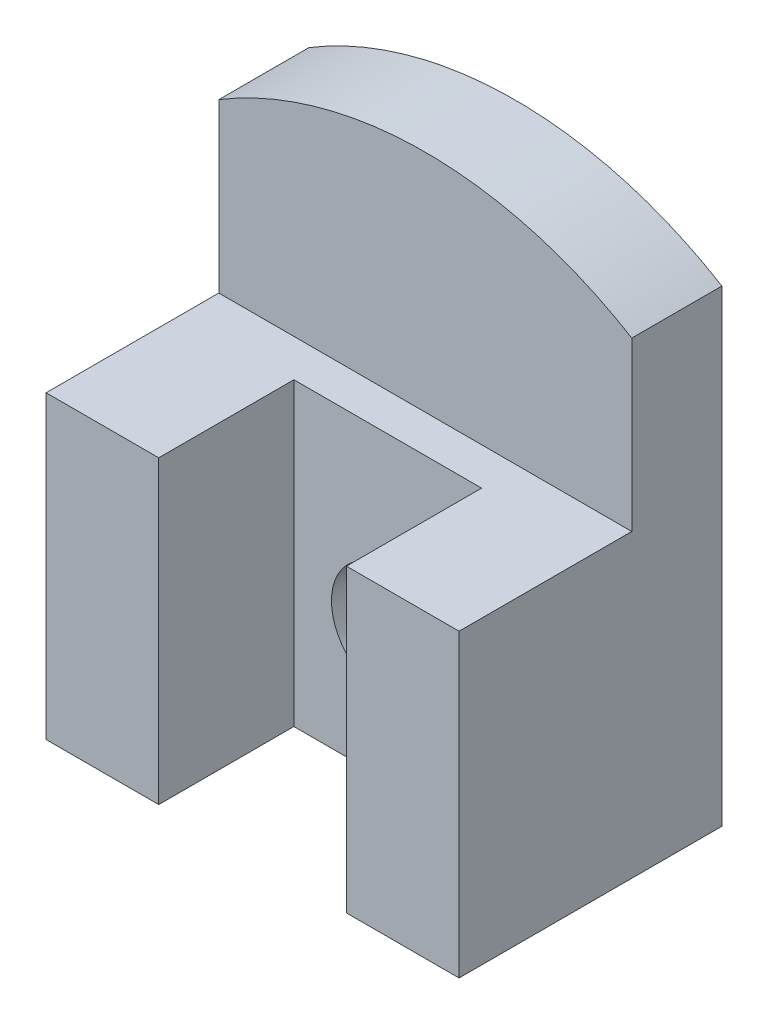
ISO-10303-21;
HEADER;
FILE_DESCRIPTION(('STEP AP214'),'2;1');
FILE_NAME('part.step','',(''),(''),'','','');
FILE_SCHEMA(('AUTOMOTIVE_DESIGN { 1 0 10303 214 1 1 1 1 }'));
ENDSEC;
DATA;
#1=APPLICATION_CONTEXT('core data for automotive mechanical design processes');
#2=APPLICATION_PROTOCOL_DEFINITION('international standard','automotive_design',2000,#1);
#3=PRODUCT_CONTEXT('',#1,'mechanical');
#4=PRODUCT('Part','Part','',(#3));
#5=PRODUCT_RELATED_PRODUCT_CATEGORY('part','',(#4));
#6=PRODUCT_DEFINITION_FORMATION('','',#4);
#7=PRODUCT_DEFINITION_CONTEXT('part definition',#1,'design');
#8=PRODUCT_DEFINITION('design','',#6,#7);
#9=PRODUCT_DEFINITION_SHAPE('','',#8);
#10=(LENGTH_UNIT() NAMED_UNIT(*) SI_UNIT(.MILLI.,.METRE.));
#11=(NAMED_UNIT(*) PLANE_ANGLE_UNIT() SI_UNIT($,.RADIAN.));
#12=(NAMED_UNIT(*) SI_UNIT($,.STERADIAN.) SOLID_ANGLE_UNIT());
#13=UNCERTAINTY_MEASURE_WITH_UNIT(LENGTH_MEASURE(1.E-05),#10,'distance_accuracy_value','');
#14=(GEOMETRIC_REPRESENTATION_CONTEXT(3) GLOBAL_UNCERTAINTY_ASSIGNED_CONTEXT((#13)) GLOBAL_UNIT_ASSIGNED_CONTEXT((#10,
#11,#12)) REPRESENTATION_CONTEXT('',''));
#15=CARTESIAN_POINT('',(0.,0.,0.));
#16=DIRECTION('',(0.,0.,1.));
#17=DIRECTION('',(1.,0.,0.));
#18=AXIS2_PLACEMENT_3D('',#15,#16,#17);
#19=CARTESIAN_POINT('',(15.,40.,0.));
#20=DIRECTION('',(0.,0.,-1.));
#21=DIRECTION('',(-1.,0.,0.));
#22=AXIS2_PLACEMENT_3D('',#19,#20,#21);
#23=PLANE('',#22);
#24=DIRECTION('',(1.,0.,0.));
#25=VECTOR('',#24,1.);
#26=CARTESIAN_POINT('',(15.,0.,0.));
#27=LINE('',#26,#25);
#28=CARTESIAN_POINT('',(0.,0.,0.));
#29=VERTEX_POINT('',#28);
#30=CARTESIAN_POINT('',(15.,0.,0.));
#31=VERTEX_POINT('',#30);
#32=EDGE_CURVE('E145',#29,#31,#27,.T.);
#33=ORIENTED_EDGE('',*,*,#32,.T.);
#34=DIRECTION('',(0.,-1.,0.));
#35=VECTOR('',#34,1.);
#36=CARTESIAN_POINT('',(15.,40.,0.));
#37=LINE('',#36,#35);
#38=CARTESIAN_POINT('',(15.,40.,0.));
#39=VERTEX_POINT('',#38);
#40=EDGE_CURVE('E11',#39,#31,#37,.T.);
#41=ORIENTED_EDGE('',*,*,#40,.F.);
#42=DIRECTION('',(1.,0.,0.));
#43=VECTOR('',#42,1.);
#44=CARTESIAN_POINT('',(15.,40.,0.));
#45=LINE('',#44,#43);
#46=CARTESIAN_POINT('',(0.,40.,0.));
#47=VERTEX_POINT('',#46);
#48=EDGE_CURVE('E167',#47,#39,#45,.T.);
#49=ORIENTED_EDGE('',*,*,#48,.F.);
#50=DIRECTION('',(0.,-1.,0.));
#51=VECTOR('',#50,1.);
#52=CARTESIAN_POINT('',(0.,40.,0.));
#53=LINE('',#52,#51);
#54=EDGE_CURVE('E144',#47,#29,#53,.T.);
#55=ORIENTED_EDGE('',*,*,#54,.T.);
#56=EDGE_LOOP('',(#33,#41,#49,#55));
#57=FACE_BOUND('',#56,.T.);
#58=ADVANCED_FACE('F39',(#57),#23,.F.);
#59=CARTESIAN_POINT('',(15.,40.,-18.));
#60=DIRECTION('',(-1.,0.,0.));
#61=DIRECTION('',(0.,0.,1.));
#62=AXIS2_PLACEMENT_3D('',#59,#60,#61);
#63=PLANE('',#62);
#64=DIRECTION('',(0.,0.,-1.));
#65=VECTOR('',#64,1.);
#66=CARTESIAN_POINT('',(15.,0.,-18.));
#67=LINE('',#66,#65);
#68=CARTESIAN_POINT('',(15.,0.,-18.));
#69=VERTEX_POINT('',#68);
#70=EDGE_CURVE('E149',#31,#69,#67,.T.);
#71=ORIENTED_EDGE('',*,*,#70,.T.);
#72=DIRECTION('',(0.,-1.,0.));
#73=VECTOR('',#72,1.);
#74=CARTESIAN_POINT('',(15.,40.,-18.));
#75=LINE('',#74,#73);
#76=CARTESIAN_POINT('',(15.,40.,-18.));
#77=VERTEX_POINT('',#76);
#78=EDGE_CURVE('E47',#77,#69,#75,.T.);
#79=ORIENTED_EDGE('',*,*,#78,.F.);
#80=DIRECTION('',(0.,0.,-1.));
#81=VECTOR('',#80,1.);
#82=CARTESIAN_POINT('',(15.,40.,-18.));
#83=LINE('',#82,#81);
#84=EDGE_CURVE('E98',#39,#77,#83,.T.);
#85=ORIENTED_EDGE('',*,*,#84,.F.);
#86=ORIENTED_EDGE('',*,*,#40,.T.);
#87=EDGE_LOOP('',(#71,#79,#85,#86));
#88=FACE_BOUND('',#87,.T.);
#89=ADVANCED_FACE('F251',(#88),#63,.F.);
#90=CARTESIAN_POINT('',(40.,40.,-18.));
#91=DIRECTION('',(0.,0.,-1.));
#92=DIRECTION('',(-1.,0.,0.));
#93=AXIS2_PLACEMENT_3D('',#90,#91,#92);
#94=PLANE('',#93);
#95=CARTESIAN_POINT('',(27.5,17.,-18.));
#96=DIRECTION('',(0.,0.,-1.));
#97=DIRECTION('',(-1.,0.,0.));
#98=AXIS2_PLACEMENT_3D('',#95,#96,#97);
#99=CIRCLE('',#98,7.5);
#100=CARTESIAN_POINT('',(20.,17.,-18.));
#101=VERTEX_POINT('',#100);
#102=EDGE_CURVE('E232',#101,#101,#99,.T.);
#103=ORIENTED_EDGE('',*,*,#102,.T.);
#104=EDGE_LOOP('',(#103));
#105=FACE_BOUND('',#104,.T.);
#106=DIRECTION('',(1.,0.,0.));
#107=VECTOR('',#106,1.);
#108=CARTESIAN_POINT('',(40.,0.,-18.));
#109=LINE('',#108,#107);
#110=CARTESIAN_POINT('',(40.,0.,-18.));
#111=VERTEX_POINT('',#110);
#112=EDGE_CURVE('E153',#69,#111,#109,.T.);
#113=ORIENTED_EDGE('',*,*,#112,.T.);
#114=DIRECTION('',(0.,-1.,0.));
#115=VECTOR('',#114,1.);
#116=CARTESIAN_POINT('',(40.,40.,-18.));
#117=LINE('',#116,#115);
#118=CARTESIAN_POINT('',(40.,40.,-18.));
#119=VERTEX_POINT('',#118);
#120=EDGE_CURVE('E129',#119,#111,#117,.T.);
#121=ORIENTED_EDGE('',*,*,#120,.F.);
#122=DIRECTION('',(1.,0.,0.));
#123=VECTOR('',#122,1.);
#124=CARTESIAN_POINT('',(40.,40.,-18.));
#125=LINE('',#124,#123);
#126=EDGE_CURVE('E115',#77,#119,#125,.T.);
#127=ORIENTED_EDGE('',*,*,#126,.F.);
#128=ORIENTED_EDGE('',*,*,#78,.T.);
#129=EDGE_LOOP('',(#113,#121,#127,#128));
#130=FACE_BOUND('',#129,.T.);
#131=ADVANCED_FACE('F177',(#105,#130),#94,.F.);
#132=CARTESIAN_POINT('',(40.,40.,0.));
#133=DIRECTION('',(1.,0.,0.));
#134=DIRECTION('',(0.,0.,-1.));
#135=AXIS2_PLACEMENT_3D('',#132,#133,#134);
#136=PLANE('',#135);
#137=DIRECTION('',(0.,0.,1.));
#138=VECTOR('',#137,1.);
#139=CARTESIAN_POINT('',(40.,0.,0.));
#140=LINE('',#139,#138);
#141=CARTESIAN_POINT('',(40.,0.,0.));
#142=VERTEX_POINT('',#141);
#143=EDGE_CURVE('E125',#111,#142,#140,.T.);
#144=ORIENTED_EDGE('',*,*,#143,.T.);
#145=DIRECTION('',(0.,-1.,0.));
#146=VECTOR('',#145,1.);
#147=CARTESIAN_POINT('',(40.,40.,0.));
#148=LINE('',#147,#146);
#149=CARTESIAN_POINT('',(40.,40.,0.));
#150=VERTEX_POINT('',#149);
#151=EDGE_CURVE('E122',#150,#142,#148,.T.);
#152=ORIENTED_EDGE('',*,*,#151,.F.);
#153=DIRECTION('',(0.,0.,1.));
#154=VECTOR('',#153,1.);
#155=CARTESIAN_POINT('',(40.,40.,0.));
#156=LINE('',#155,#154);
#157=EDGE_CURVE('E107',#119,#150,#156,.T.);
#158=ORIENTED_EDGE('',*,*,#157,.F.);
#159=ORIENTED_EDGE('',*,*,#120,.T.);
#160=EDGE_LOOP('',(#144,#152,#158,#159));
#161=FACE_BOUND('',#160,.T.);
#162=ADVANCED_FACE('F123',(#161),#136,.F.);
#163=CARTESIAN_POINT('',(55.,40.,0.));
#164=DIRECTION('',(0.,0.,-1.));
#165=DIRECTION('',(-1.,0.,0.));
#166=AXIS2_PLACEMENT_3D('',#163,#164,#165);
#167=PLANE('',#166);
#168=DIRECTION('',(1.,0.,0.));
#169=VECTOR('',#168,1.);
#170=CARTESIAN_POINT('',(55.,0.,0.));
#171=LINE('',#170,#169);
#172=CARTESIAN_POINT('',(55.,0.,0.));
#173=VERTEX_POINT('',#172);
#174=EDGE_CURVE('E158',#142,#173,#171,.T.);
#175=ORIENTED_EDGE('',*,*,#174,.T.);
#176=DIRECTION('',(0.,-1.,0.));
#177=VECTOR('',#176,1.);
#178=CARTESIAN_POINT('',(55.,40.,0.));
#179=LINE('',#178,#177);
#180=CARTESIAN_POINT('',(55.,40.,0.));
#181=VERTEX_POINT('',#180);
#182=EDGE_CURVE('E130',#181,#173,#179,.T.);
#183=ORIENTED_EDGE('',*,*,#182,.F.);
#184=DIRECTION('',(1.,0.,0.));
#185=VECTOR('',#184,1.);
#186=CARTESIAN_POINT('',(55.,40.,0.));
#187=LINE('',#186,#185);
#188=EDGE_CURVE('E112',#150,#181,#187,.T.);
#189=ORIENTED_EDGE('',*,*,#188,.F.);
#190=ORIENTED_EDGE('',*,*,#151,.T.);
#191=EDGE_LOOP('',(#175,#183,#189,#190));
#192=FACE_BOUND('',#191,.T.);
#193=ADVANCED_FACE('F132',(#192),#167,.F.);
#194=CARTESIAN_POINT('',(55.,40.,-23.));
#195=DIRECTION('',(-1.,0.,0.));
#196=DIRECTION('',(0.,0.,1.));
#197=AXIS2_PLACEMENT_3D('',#194,#195,#196);
#198=PLANE('',#197);
#199=DIRECTION('',(0.,0.,-1.));
#200=VECTOR('',#199,1.);
#201=CARTESIAN_POINT('',(55.,0.,-23.));
#202=LINE('',#201,#200);
#203=CARTESIAN_POINT('',(55.,0.,-35.));
#204=VERTEX_POINT('',#203);
#205=EDGE_CURVE('E161',#173,#204,#202,.T.);
#206=ORIENTED_EDGE('',*,*,#205,.T.);
#207=DIRECTION('',(0.,-1.,0.));
#208=VECTOR('',#207,1.);
#209=CARTESIAN_POINT('',(55.,40.,-35.));
#210=LINE('',#209,#208);
#211=CARTESIAN_POINT('',(55.,62.3072841825683,-35.));
#212=VERTEX_POINT('',#211);
#213=EDGE_CURVE('E150',#212,#204,#210,.T.);
#214=ORIENTED_EDGE('',*,*,#213,.F.);
#215=DIRECTION('',(0.,0.,-1.));
#216=VECTOR('',#215,1.);
#217=CARTESIAN_POINT('',(55.,62.3072841825683,-23.));
#218=LINE('',#217,#216);
#219=CARTESIAN_POINT('',(55.,62.3072841825683,-23.));
#220=VERTEX_POINT('',#219);
#221=EDGE_CURVE('E216',#220,#212,#218,.T.);
#222=ORIENTED_EDGE('',*,*,#221,.F.);
#223=DIRECTION('',(0.,-1.,0.));
#224=VECTOR('',#223,1.);
#225=CARTESIAN_POINT('',(55.,40.,-23.));
#226=LINE('',#225,#224);
#227=CARTESIAN_POINT('',(55.,40.,-23.));
#228=VERTEX_POINT('',#227);
#229=EDGE_CURVE('E191',#220,#228,#226,.T.);
#230=ORIENTED_EDGE('',*,*,#229,.T.);
#231=DIRECTION('',(0.,0.,-1.));
#232=VECTOR('',#231,1.);
#233=CARTESIAN_POINT('',(55.,40.,-23.));
#234=LINE('',#233,#232);
#235=EDGE_CURVE('E136',#181,#228,#234,.T.);
#236=ORIENTED_EDGE('',*,*,#235,.F.);
#237=ORIENTED_EDGE('',*,*,#182,.T.);
#238=EDGE_LOOP('',(#206,#214,#222,#230,#236,#237));
#239=FACE_BOUND('',#238,.T.);
#240=ADVANCED_FACE('F184',(#239),#198,.F.);
#241=CARTESIAN_POINT('',(0.,40.,0.));
#242=DIRECTION('',(1.,0.,0.));
#243=DIRECTION('',(0.,0.,-1.));
#244=AXIS2_PLACEMENT_3D('',#241,#242,#243);
#245=PLANE('',#244);
#246=DIRECTION('',(0.,0.,1.));
#247=VECTOR('',#246,1.);
#248=CARTESIAN_POINT('',(0.,0.,0.));
#249=LINE('',#248,#247);
#250=CARTESIAN_POINT('',(0.,0.,-35.));
#251=VERTEX_POINT('',#250);
#252=EDGE_CURVE('E90',#251,#29,#249,.T.);
#253=ORIENTED_EDGE('',*,*,#252,.T.);
#254=ORIENTED_EDGE('',*,*,#54,.F.);
#255=DIRECTION('',(0.,0.,1.));
#256=VECTOR('',#255,1.);
#257=CARTESIAN_POINT('',(0.,40.,0.));
#258=LINE('',#257,#256);
#259=CARTESIAN_POINT('',(0.,40.,-23.));
#260=VERTEX_POINT('',#259);
#261=EDGE_CURVE('E62',#260,#47,#258,.T.);
#262=ORIENTED_EDGE('',*,*,#261,.F.);
#263=DIRECTION('',(0.,1.,0.));
#264=VECTOR('',#263,1.);
#265=CARTESIAN_POINT('',(0.,40.,-23.));
#266=LINE('',#265,#264);
#267=CARTESIAN_POINT('',(0.,62.3072841825683,-23.));
#268=VERTEX_POINT('',#267);
#269=EDGE_CURVE('E54',#260,#268,#266,.T.);
#270=ORIENTED_EDGE('',*,*,#269,.T.);
#271=DIRECTION('',(0.,0.,-1.));
#272=VECTOR('',#271,1.);
#273=CARTESIAN_POINT('',(0.,62.3072841825683,-23.));
#274=LINE('',#273,#272);
#275=CARTESIAN_POINT('',(0.,62.3072841825683,-35.));
#276=VERTEX_POINT('',#275);
#277=EDGE_CURVE('E210',#268,#276,#274,.T.);
#278=ORIENTED_EDGE('',*,*,#277,.T.);
#279=DIRECTION('',(0.,-1.,0.));
#280=VECTOR('',#279,1.);
#281=CARTESIAN_POINT('',(0.,40.,-35.));
#282=LINE('',#281,#280);
#283=EDGE_CURVE('E239',#276,#251,#282,.T.);
#284=ORIENTED_EDGE('',*,*,#283,.T.);
#285=EDGE_LOOP('',(#253,#254,#262,#270,#278,#284));
#286=FACE_BOUND('',#285,.T.);
#287=ADVANCED_FACE('F221',(#286),#245,.F.);
#288=CARTESIAN_POINT('',(0.,40.,0.));
#289=DIRECTION('',(0.,-1.,0.));
#290=DIRECTION('',(0.,0.,-1.));
#291=AXIS2_PLACEMENT_3D('',#288,#289,#290);
#292=PLANE('',#291);
#293=ORIENTED_EDGE('',*,*,#235,.T.);
#294=DIRECTION('',(-1.,0.,0.));
#295=VECTOR('',#294,1.);
#296=CARTESIAN_POINT('',(55.,40.,-23.));
#297=LINE('',#296,#295);
#298=EDGE_CURVE('E192',#228,#260,#297,.T.);
#299=ORIENTED_EDGE('',*,*,#298,.T.);
#300=ORIENTED_EDGE('',*,*,#261,.T.);
#301=ORIENTED_EDGE('',*,*,#48,.T.);
#302=ORIENTED_EDGE('',*,*,#84,.T.);
#303=ORIENTED_EDGE('',*,*,#126,.T.);
#304=ORIENTED_EDGE('',*,*,#157,.T.);
#305=ORIENTED_EDGE('',*,*,#188,.T.);
#306=EDGE_LOOP('',(#293,#299,#300,#301,#302,#303,#304,#305));
#307=FACE_BOUND('',#306,.T.);
#308=ADVANCED_FACE('F110',(#307),#292,.F.);
#309=CARTESIAN_POINT('',(0.,0.,0.));
#310=DIRECTION('',(0.,-1.,0.));
#311=DIRECTION('',(0.,0.,-1.));
#312=AXIS2_PLACEMENT_3D('',#309,#310,#311);
#313=PLANE('',#312);
#314=ORIENTED_EDGE('',*,*,#32,.F.);
#315=ORIENTED_EDGE('',*,*,#252,.F.);
#316=DIRECTION('',(-1.,0.,0.));
#317=VECTOR('',#316,1.);
#318=CARTESIAN_POINT('',(0.,0.,-35.));
#319=LINE('',#318,#317);
#320=EDGE_CURVE('E234',#204,#251,#319,.T.);
#321=ORIENTED_EDGE('',*,*,#320,.F.);
#322=ORIENTED_EDGE('',*,*,#205,.F.);
#323=ORIENTED_EDGE('',*,*,#174,.F.);
#324=ORIENTED_EDGE('',*,*,#143,.F.);
#325=ORIENTED_EDGE('',*,*,#112,.F.);
#326=ORIENTED_EDGE('',*,*,#70,.F.);
#327=EDGE_LOOP('',(#314,#315,#321,#322,#323,#324,#325,#326));
#328=FACE_BOUND('',#327,.T.);
#329=ADVANCED_FACE('F180',(#328),#313,.T.);
#330=CARTESIAN_POINT('',(0.,40.,-35.));
#331=DIRECTION('',(0.,0.,1.));
#332=DIRECTION('',(1.,0.,0.));
#333=AXIS2_PLACEMENT_3D('',#330,#331,#332);
#334=PLANE('',#333);
#335=CARTESIAN_POINT('',(27.5,17.,-35.));
#336=DIRECTION('',(0.,0.,-1.));
#337=DIRECTION('',(-1.,0.,0.));
#338=AXIS2_PLACEMENT_3D('',#335,#336,#337);
#339=CIRCLE('',#338,7.5);
#340=CARTESIAN_POINT('',(20.,17.,-35.));
#341=VERTEX_POINT('',#340);
#342=EDGE_CURVE('E288',#341,#341,#339,.T.);
#343=ORIENTED_EDGE('',*,*,#342,.F.);
#344=EDGE_LOOP('',(#343));
#345=FACE_BOUND('',#344,.T.);
#346=ORIENTED_EDGE('',*,*,#320,.T.);
#347=ORIENTED_EDGE('',*,*,#283,.F.);
#348=CARTESIAN_POINT('',(27.5,17.,-35.));
#349=DIRECTION('',(0.,0.,-1.));
#350=DIRECTION('',(-1.,0.,0.));
#351=AXIS2_PLACEMENT_3D('',#348,#349,#350);
#352=CIRCLE('',#351,53.);
#353=EDGE_CURVE('E214',#276,#212,#352,.T.);
#354=ORIENTED_EDGE('',*,*,#353,.T.);
#355=ORIENTED_EDGE('',*,*,#213,.T.);
#356=EDGE_LOOP('',(#346,#347,#354,#355));
#357=FACE_BOUND('',#356,.T.);
#358=ADVANCED_FACE('F270',(#345,#357),#334,.F.);
#359=CARTESIAN_POINT('',(27.5,17.,-23.));
#360=DIRECTION('',(0.,0.,-1.));
#361=DIRECTION('',(-1.,0.,0.));
#362=AXIS2_PLACEMENT_3D('',#359,#360,#361);
#363=CYLINDRICAL_SURFACE('',#362,53.);
#364=ORIENTED_EDGE('',*,*,#353,.F.);
#365=ORIENTED_EDGE('',*,*,#277,.F.);
#366=CARTESIAN_POINT('',(27.5,17.,-23.));
#367=DIRECTION('',(0.,0.,-1.));
#368=DIRECTION('',(-1.,0.,0.));
#369=AXIS2_PLACEMENT_3D('',#366,#367,#368);
#370=CIRCLE('',#369,53.);
#371=EDGE_CURVE('E212',#268,#220,#370,.T.);
#372=ORIENTED_EDGE('',*,*,#371,.T.);
#373=ORIENTED_EDGE('',*,*,#221,.T.);
#374=EDGE_LOOP('',(#364,#365,#372,#373));
#375=FACE_BOUND('',#374,.T.);
#376=ADVANCED_FACE('F211',(#375),#363,.T.);
#377=CARTESIAN_POINT('',(27.5,17.,-23.));
#378=DIRECTION('',(0.,0.,-1.));
#379=DIRECTION('',(-1.,0.,0.));
#380=AXIS2_PLACEMENT_3D('',#377,#378,#379);
#381=PLANE('',#380);
#382=ORIENTED_EDGE('',*,*,#298,.F.);
#383=ORIENTED_EDGE('',*,*,#229,.F.);
#384=ORIENTED_EDGE('',*,*,#371,.F.);
#385=ORIENTED_EDGE('',*,*,#269,.F.);
#386=EDGE_LOOP('',(#382,#383,#384,#385));
#387=FACE_BOUND('',#386,.T.);
#388=ADVANCED_FACE('F218',(#387),#381,.F.);
#389=CARTESIAN_POINT('',(27.5,17.,0.));
#390=DIRECTION('',(0.,0.,-1.));
#391=DIRECTION('',(-1.,0.,0.));
#392=AXIS2_PLACEMENT_3D('',#389,#390,#391);
#393=CYLINDRICAL_SURFACE('',#392,7.5);
#394=ORIENTED_EDGE('',*,*,#342,.T.);
#395=EDGE_LOOP('',(#394));
#396=FACE_BOUND('',#395,.T.);
#397=ORIENTED_EDGE('',*,*,#102,.F.);
#398=EDGE_LOOP('',(#397));
#399=FACE_BOUND('',#398,.T.);
#400=ADVANCED_FACE('F280',(#396,#399),#393,.F.);
#401=CLOSED_SHELL('',(#58,#89,#131,#162,#193,#240,#287,#308,#329,#358,#376,#388,#400));
#402=MANIFOLD_SOLID_BREP('B2',#401);
#403=ADVANCED_BREP_SHAPE_REPRESENTATION('',(#18,#402),#14);
#404=SHAPE_DEFINITION_REPRESENTATION(#9,#403);
ENDSEC;
END-ISO-10303-21;
